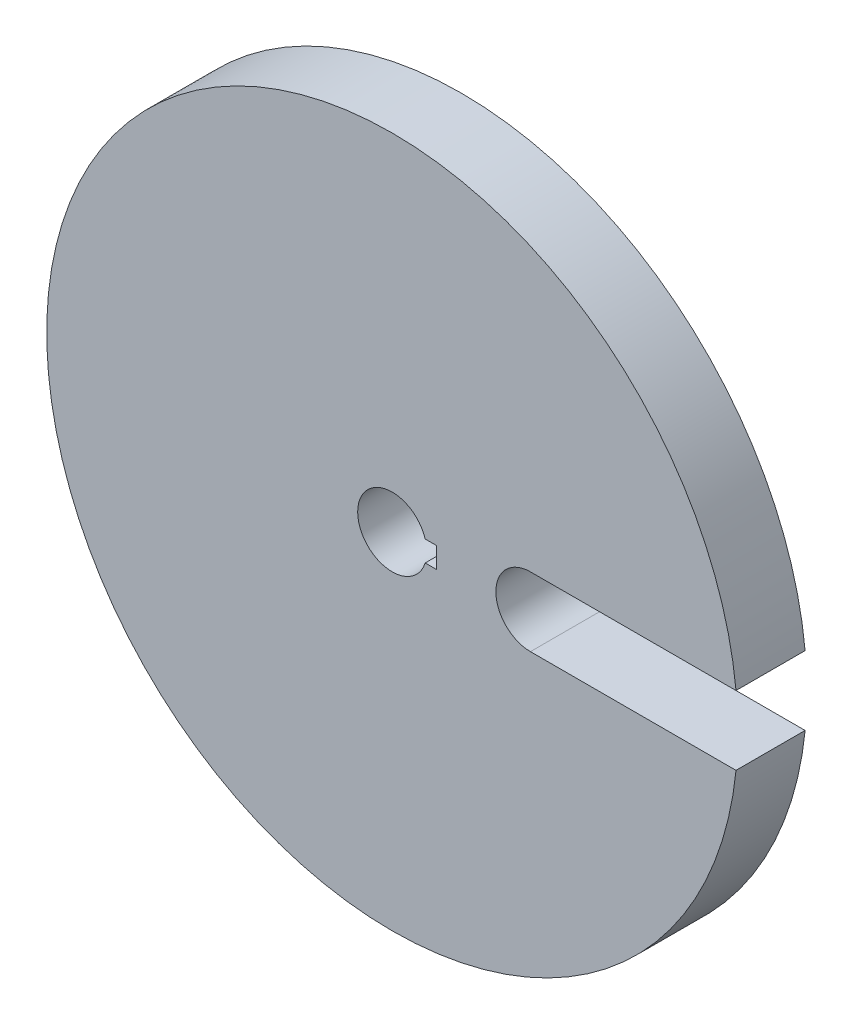
ISO-10303-21;
HEADER;
FILE_DESCRIPTION(('STEP AP214'),'2;1');
FILE_NAME('part.step','',(''),(''),'','','');
FILE_SCHEMA(('AUTOMOTIVE_DESIGN { 1 0 10303 214 1 1 1 1 }'));
ENDSEC;
DATA;
#1=APPLICATION_CONTEXT('core data for automotive mechanical design processes');
#2=APPLICATION_PROTOCOL_DEFINITION('international standard','automotive_design',2000,#1);
#3=PRODUCT_CONTEXT('',#1,'mechanical');
#4=PRODUCT('Part','Part','',(#3));
#5=PRODUCT_RELATED_PRODUCT_CATEGORY('part','',(#4));
#6=PRODUCT_DEFINITION_FORMATION('','',#4);
#7=PRODUCT_DEFINITION_CONTEXT('part definition',#1,'design');
#8=PRODUCT_DEFINITION('design','',#6,#7);
#9=PRODUCT_DEFINITION_SHAPE('','',#8);
#10=(LENGTH_UNIT() NAMED_UNIT(*) SI_UNIT(.MILLI.,.METRE.));
#11=(NAMED_UNIT(*) PLANE_ANGLE_UNIT() SI_UNIT($,.RADIAN.));
#12=(NAMED_UNIT(*) SI_UNIT($,.STERADIAN.) SOLID_ANGLE_UNIT());
#13=UNCERTAINTY_MEASURE_WITH_UNIT(LENGTH_MEASURE(1.E-05),#10,'distance_accuracy_value','');
#14=(GEOMETRIC_REPRESENTATION_CONTEXT(3) GLOBAL_UNCERTAINTY_ASSIGNED_CONTEXT((#13)) GLOBAL_UNIT_ASSIGNED_CONTEXT((#10,
#11,#12)) REPRESENTATION_CONTEXT('',''));
#15=CARTESIAN_POINT('',(0.,0.,0.));
#16=DIRECTION('',(0.,0.,1.));
#17=DIRECTION('',(1.,0.,0.));
#18=AXIS2_PLACEMENT_3D('',#15,#16,#17);
#19=CARTESIAN_POINT('',(0.,0.,10.));
#20=DIRECTION('',(0.,0.,-1.));
#21=DIRECTION('',(-1.,0.,0.));
#22=AXIS2_PLACEMENT_3D('',#19,#20,#21);
#23=CYLINDRICAL_SURFACE('',#22,50.);
#24=CARTESIAN_POINT('',(0.,0.,0.));
#25=DIRECTION('',(0.,0.,1.));
#26=DIRECTION('',(1.,0.,0.));
#27=AXIS2_PLACEMENT_3D('',#24,#25,#26);
#28=CIRCLE('',#27,50.);
#29=CARTESIAN_POINT('',(49.749371855331,5.,0.));
#30=VERTEX_POINT('',#29);
#31=CARTESIAN_POINT('',(49.749371855331,-5.,0.));
#32=VERTEX_POINT('',#31);
#33=EDGE_CURVE('E124',#30,#32,#28,.T.);
#34=ORIENTED_EDGE('',*,*,#33,.T.);
#35=DIRECTION('',(0.,0.,1.));
#36=VECTOR('',#35,1.);
#37=CARTESIAN_POINT('',(49.749371855331,-5.,0.));
#38=LINE('',#37,#36);
#39=CARTESIAN_POINT('',(49.749371855331,-5.,10.));
#40=VERTEX_POINT('',#39);
#41=EDGE_CURVE('E175',#32,#40,#38,.T.);
#42=ORIENTED_EDGE('',*,*,#41,.T.);
#43=CARTESIAN_POINT('',(0.,0.,10.));
#44=DIRECTION('',(0.,0.,1.));
#45=DIRECTION('',(1.,0.,0.));
#46=AXIS2_PLACEMENT_3D('',#43,#44,#45);
#47=CIRCLE('',#46,50.);
#48=CARTESIAN_POINT('',(49.749371855331,5.,10.));
#49=VERTEX_POINT('',#48);
#50=EDGE_CURVE('E126',#49,#40,#47,.T.);
#51=ORIENTED_EDGE('',*,*,#50,.F.);
#52=DIRECTION('',(0.,0.,1.));
#53=VECTOR('',#52,1.);
#54=CARTESIAN_POINT('',(49.749371855331,5.,0.));
#55=LINE('',#54,#53);
#56=EDGE_CURVE('E111',#30,#49,#55,.T.);
#57=ORIENTED_EDGE('',*,*,#56,.F.);
#58=EDGE_LOOP('',(#34,#42,#51,#57));
#59=FACE_BOUND('',#58,.T.);
#60=ADVANCED_FACE('F45',(#59),#23,.T.);
#61=CARTESIAN_POINT('',(0.,0.,10.));
#62=DIRECTION('',(0.,0.,1.));
#63=DIRECTION('',(1.,0.,0.));
#64=AXIS2_PLACEMENT_3D('',#61,#62,#63);
#65=PLANE('',#64);
#66=DIRECTION('',(1.,0.,0.));
#67=VECTOR('',#66,1.);
#68=CARTESIAN_POINT('',(0.,-5.,10.));
#69=LINE('',#68,#67);
#70=CARTESIAN_POINT('',(20.,-5.,10.));
#71=VERTEX_POINT('',#70);
#72=EDGE_CURVE('E118',#71,#40,#69,.T.);
#73=ORIENTED_EDGE('',*,*,#72,.F.);
#74=CARTESIAN_POINT('',(20.,0.,10.));
#75=DIRECTION('',(0.,0.,1.));
#76=DIRECTION('',(1.,0.,0.));
#77=AXIS2_PLACEMENT_3D('',#74,#75,#76);
#78=CIRCLE('',#77,5.);
#79=CARTESIAN_POINT('',(20.,5.,10.));
#80=VERTEX_POINT('',#79);
#81=EDGE_CURVE('E194',#71,#80,#78,.F.);
#82=ORIENTED_EDGE('',*,*,#81,.T.);
#83=DIRECTION('',(1.,0.,0.));
#84=VECTOR('',#83,1.);
#85=CARTESIAN_POINT('',(0.,5.,10.));
#86=LINE('',#85,#84);
#87=EDGE_CURVE('E198',#80,#49,#86,.T.);
#88=ORIENTED_EDGE('',*,*,#87,.T.);
#89=ORIENTED_EDGE('',*,*,#50,.T.);
#90=EDGE_LOOP('',(#73,#82,#88,#89));
#91=FACE_BOUND('',#90,.T.);
#92=DIRECTION('',(1.,0.,0.));
#93=VECTOR('',#92,1.);
#94=CARTESIAN_POINT('',(6.4,-1.49999999999998,10.));
#95=LINE('',#94,#93);
#96=CARTESIAN_POINT('',(4.76969600708473,-1.49999999999998,10.));
#97=VERTEX_POINT('',#96);
#98=CARTESIAN_POINT('',(6.4,-1.49999999999998,10.));
#99=VERTEX_POINT('',#98);
#100=EDGE_CURVE('E155',#97,#99,#95,.T.);
#101=ORIENTED_EDGE('',*,*,#100,.F.);
#102=CARTESIAN_POINT('',(0.,0.,10.));
#103=DIRECTION('',(0.,0.,1.));
#104=DIRECTION('',(1.,0.,0.));
#105=AXIS2_PLACEMENT_3D('',#102,#103,#104);
#106=CIRCLE('',#105,5.);
#107=CARTESIAN_POINT('',(4.76969600708472,1.50000000000002,10.));
#108=VERTEX_POINT('',#107);
#109=EDGE_CURVE('E140',#108,#97,#106,.T.);
#110=ORIENTED_EDGE('',*,*,#109,.F.);
#111=DIRECTION('',(-1.,0.,0.));
#112=VECTOR('',#111,1.);
#113=CARTESIAN_POINT('',(6.39999999999999,1.50000000000002,10.));
#114=LINE('',#113,#112);
#115=CARTESIAN_POINT('',(6.39999999999999,1.50000000000002,10.));
#116=VERTEX_POINT('',#115);
#117=EDGE_CURVE('E68',#116,#108,#114,.T.);
#118=ORIENTED_EDGE('',*,*,#117,.F.);
#119=DIRECTION('',(0.,1.,0.));
#120=VECTOR('',#119,1.);
#121=CARTESIAN_POINT('',(6.39999999999999,1.50000000000002,10.));
#122=LINE('',#121,#120);
#123=EDGE_CURVE('E169',#99,#116,#122,.T.);
#124=ORIENTED_EDGE('',*,*,#123,.F.);
#125=EDGE_LOOP('',(#101,#110,#118,#124));
#126=FACE_BOUND('',#125,.T.);
#127=ADVANCED_FACE('F153',(#91,#126),#65,.T.);
#128=CARTESIAN_POINT('',(0.,0.,0.));
#129=DIRECTION('',(0.,0.,1.));
#130=DIRECTION('',(1.,0.,0.));
#131=AXIS2_PLACEMENT_3D('',#128,#129,#130);
#132=PLANE('',#131);
#133=CARTESIAN_POINT('',(0.,0.,0.));
#134=DIRECTION('',(0.,0.,1.));
#135=DIRECTION('',(1.,0.,0.));
#136=AXIS2_PLACEMENT_3D('',#133,#134,#135);
#137=CIRCLE('',#136,5.);
#138=CARTESIAN_POINT('',(4.76969600708472,1.50000000000002,0.));
#139=VERTEX_POINT('',#138);
#140=CARTESIAN_POINT('',(4.76969600708473,-1.49999999999998,0.));
#141=VERTEX_POINT('',#140);
#142=EDGE_CURVE('E134',#139,#141,#137,.T.);
#143=ORIENTED_EDGE('',*,*,#142,.T.);
#144=DIRECTION('',(1.,0.,0.));
#145=VECTOR('',#144,1.);
#146=CARTESIAN_POINT('',(6.4,-1.49999999999998,0.));
#147=LINE('',#146,#145);
#148=CARTESIAN_POINT('',(6.4,-1.49999999999998,0.));
#149=VERTEX_POINT('',#148);
#150=EDGE_CURVE('E168',#141,#149,#147,.T.);
#151=ORIENTED_EDGE('',*,*,#150,.T.);
#152=DIRECTION('',(0.,1.,0.));
#153=VECTOR('',#152,1.);
#154=CARTESIAN_POINT('',(6.39999999999999,1.50000000000002,0.));
#155=LINE('',#154,#153);
#156=CARTESIAN_POINT('',(6.39999999999999,1.50000000000002,0.));
#157=VERTEX_POINT('',#156);
#158=EDGE_CURVE('E178',#149,#157,#155,.T.);
#159=ORIENTED_EDGE('',*,*,#158,.T.);
#160=DIRECTION('',(-1.,0.,0.));
#161=VECTOR('',#160,1.);
#162=CARTESIAN_POINT('',(6.39999999999999,1.50000000000002,0.));
#163=LINE('',#162,#161);
#164=EDGE_CURVE('E164',#157,#139,#163,.T.);
#165=ORIENTED_EDGE('',*,*,#164,.T.);
#166=EDGE_LOOP('',(#143,#151,#159,#165));
#167=FACE_BOUND('',#166,.T.);
#168=CARTESIAN_POINT('',(20.,0.,0.));
#169=DIRECTION('',(0.,0.,1.));
#170=DIRECTION('',(1.,0.,0.));
#171=AXIS2_PLACEMENT_3D('',#168,#169,#170);
#172=CIRCLE('',#171,5.);
#173=CARTESIAN_POINT('',(20.,-5.,0.));
#174=VERTEX_POINT('',#173);
#175=CARTESIAN_POINT('',(20.,5.,0.));
#176=VERTEX_POINT('',#175);
#177=EDGE_CURVE('E117',#174,#176,#172,.F.);
#178=ORIENTED_EDGE('',*,*,#177,.F.);
#179=DIRECTION('',(1.,0.,0.));
#180=VECTOR('',#179,1.);
#181=CARTESIAN_POINT('',(0.,-5.,0.));
#182=LINE('',#181,#180);
#183=EDGE_CURVE('E128',#174,#32,#182,.T.);
#184=ORIENTED_EDGE('',*,*,#183,.T.);
#185=ORIENTED_EDGE('',*,*,#33,.F.);
#186=DIRECTION('',(1.,0.,0.));
#187=VECTOR('',#186,1.);
#188=CARTESIAN_POINT('',(0.,5.,0.));
#189=LINE('',#188,#187);
#190=EDGE_CURVE('E108',#176,#30,#189,.T.);
#191=ORIENTED_EDGE('',*,*,#190,.F.);
#192=EDGE_LOOP('',(#178,#184,#185,#191));
#193=FACE_BOUND('',#192,.T.);
#194=ADVANCED_FACE('F131',(#167,#193),#132,.F.);
#195=CARTESIAN_POINT('',(0.,0.,0.));
#196=DIRECTION('',(0.,0.,1.));
#197=DIRECTION('',(1.,0.,0.));
#198=AXIS2_PLACEMENT_3D('',#195,#196,#197);
#199=CYLINDRICAL_SURFACE('',#198,5.);
#200=ORIENTED_EDGE('',*,*,#109,.T.);
#201=DIRECTION('',(0.,0.,1.));
#202=VECTOR('',#201,1.);
#203=CARTESIAN_POINT('',(4.76969600708473,-1.49999999999998,0.));
#204=LINE('',#203,#202);
#205=EDGE_CURVE('E11',#97,#141,#204,.F.);
#206=ORIENTED_EDGE('',*,*,#205,.T.);
#207=ORIENTED_EDGE('',*,*,#142,.F.);
#208=DIRECTION('',(0.,0.,1.));
#209=VECTOR('',#208,1.);
#210=CARTESIAN_POINT('',(4.76969600708472,1.50000000000002,0.));
#211=LINE('',#210,#209);
#212=EDGE_CURVE('E53',#139,#108,#211,.T.);
#213=ORIENTED_EDGE('',*,*,#212,.T.);
#214=EDGE_LOOP('',(#200,#206,#207,#213));
#215=FACE_BOUND('',#214,.T.);
#216=ADVANCED_FACE('F148',(#215),#199,.F.);
#217=CARTESIAN_POINT('',(6.4,-1.49999999999998,0.));
#218=DIRECTION('',(0.,-1.,0.));
#219=DIRECTION('',(1.,0.,0.));
#220=AXIS2_PLACEMENT_3D('',#217,#218,#219);
#221=PLANE('',#220);
#222=ORIENTED_EDGE('',*,*,#100,.T.);
#223=DIRECTION('',(0.,0.,1.));
#224=VECTOR('',#223,1.);
#225=CARTESIAN_POINT('',(6.4,-1.49999999999998,0.));
#226=LINE('',#225,#224);
#227=EDGE_CURVE('E159',#149,#99,#226,.T.);
#228=ORIENTED_EDGE('',*,*,#227,.F.);
#229=ORIENTED_EDGE('',*,*,#150,.F.);
#230=ORIENTED_EDGE('',*,*,#205,.F.);
#231=EDGE_LOOP('',(#222,#228,#229,#230));
#232=FACE_BOUND('',#231,.T.);
#233=ADVANCED_FACE('F221',(#232),#221,.F.);
#234=CARTESIAN_POINT('',(6.39999999999999,1.50000000000002,0.));
#235=DIRECTION('',(0.,1.,0.));
#236=DIRECTION('',(-1.,0.,0.));
#237=AXIS2_PLACEMENT_3D('',#234,#235,#236);
#238=PLANE('',#237);
#239=ORIENTED_EDGE('',*,*,#164,.F.);
#240=DIRECTION('',(0.,0.,1.));
#241=VECTOR('',#240,1.);
#242=CARTESIAN_POINT('',(6.39999999999999,1.50000000000002,0.));
#243=LINE('',#242,#241);
#244=EDGE_CURVE('E157',#157,#116,#243,.T.);
#245=ORIENTED_EDGE('',*,*,#244,.T.);
#246=ORIENTED_EDGE('',*,*,#117,.T.);
#247=ORIENTED_EDGE('',*,*,#212,.F.);
#248=EDGE_LOOP('',(#239,#245,#246,#247));
#249=FACE_BOUND('',#248,.T.);
#250=ADVANCED_FACE('F224',(#249),#238,.F.);
#251=CARTESIAN_POINT('',(6.39999999999999,1.50000000000002,0.));
#252=DIRECTION('',(1.,0.,0.));
#253=DIRECTION('',(0.,1.,0.));
#254=AXIS2_PLACEMENT_3D('',#251,#252,#253);
#255=PLANE('',#254);
#256=ORIENTED_EDGE('',*,*,#123,.T.);
#257=ORIENTED_EDGE('',*,*,#244,.F.);
#258=ORIENTED_EDGE('',*,*,#158,.F.);
#259=ORIENTED_EDGE('',*,*,#227,.T.);
#260=EDGE_LOOP('',(#256,#257,#258,#259));
#261=FACE_BOUND('',#260,.T.);
#262=ADVANCED_FACE('F226',(#261),#255,.F.);
#263=CARTESIAN_POINT('',(0.,-5.,0.));
#264=DIRECTION('',(0.,-1.,0.));
#265=DIRECTION('',(0.,0.,-1.));
#266=AXIS2_PLACEMENT_3D('',#263,#264,#265);
#267=PLANE('',#266);
#268=ORIENTED_EDGE('',*,*,#72,.T.);
#269=ORIENTED_EDGE('',*,*,#41,.F.);
#270=ORIENTED_EDGE('',*,*,#183,.F.);
#271=DIRECTION('',(0.,0.,1.));
#272=VECTOR('',#271,1.);
#273=CARTESIAN_POINT('',(20.,-5.,0.));
#274=LINE('',#273,#272);
#275=EDGE_CURVE('E187',#174,#71,#274,.T.);
#276=ORIENTED_EDGE('',*,*,#275,.T.);
#277=EDGE_LOOP('',(#268,#269,#270,#276));
#278=FACE_BOUND('',#277,.T.);
#279=ADVANCED_FACE('F209',(#278),#267,.F.);
#280=CARTESIAN_POINT('',(20.,0.,0.));
#281=DIRECTION('',(0.,0.,1.));
#282=DIRECTION('',(1.,0.,0.));
#283=AXIS2_PLACEMENT_3D('',#280,#281,#282);
#284=CYLINDRICAL_SURFACE('',#283,5.);
#285=ORIENTED_EDGE('',*,*,#81,.F.);
#286=ORIENTED_EDGE('',*,*,#275,.F.);
#287=ORIENTED_EDGE('',*,*,#177,.T.);
#288=DIRECTION('',(0.,0.,1.));
#289=VECTOR('',#288,1.);
#290=CARTESIAN_POINT('',(20.,5.,0.));
#291=LINE('',#290,#289);
#292=EDGE_CURVE('E60',#176,#80,#291,.T.);
#293=ORIENTED_EDGE('',*,*,#292,.T.);
#294=EDGE_LOOP('',(#285,#286,#287,#293));
#295=FACE_BOUND('',#294,.T.);
#296=ADVANCED_FACE('F206',(#295),#284,.F.);
#297=CARTESIAN_POINT('',(0.,5.,0.));
#298=DIRECTION('',(0.,-1.,0.));
#299=DIRECTION('',(0.,0.,-1.));
#300=AXIS2_PLACEMENT_3D('',#297,#298,#299);
#301=PLANE('',#300);
#302=ORIENTED_EDGE('',*,*,#87,.F.);
#303=ORIENTED_EDGE('',*,*,#292,.F.);
#304=ORIENTED_EDGE('',*,*,#190,.T.);
#305=ORIENTED_EDGE('',*,*,#56,.T.);
#306=EDGE_LOOP('',(#302,#303,#304,#305));
#307=FACE_BOUND('',#306,.T.);
#308=ADVANCED_FACE('F110',(#307),#301,.T.);
#309=CLOSED_SHELL('',(#60,#127,#194,#216,#233,#250,#262,#279,#296,#308));
#310=MANIFOLD_SOLID_BREP('B2',#309);
#311=ADVANCED_BREP_SHAPE_REPRESENTATION('',(#18,#310),#14);
#312=SHAPE_DEFINITION_REPRESENTATION(#9,#311);
ENDSEC;
END-ISO-10303-21;
